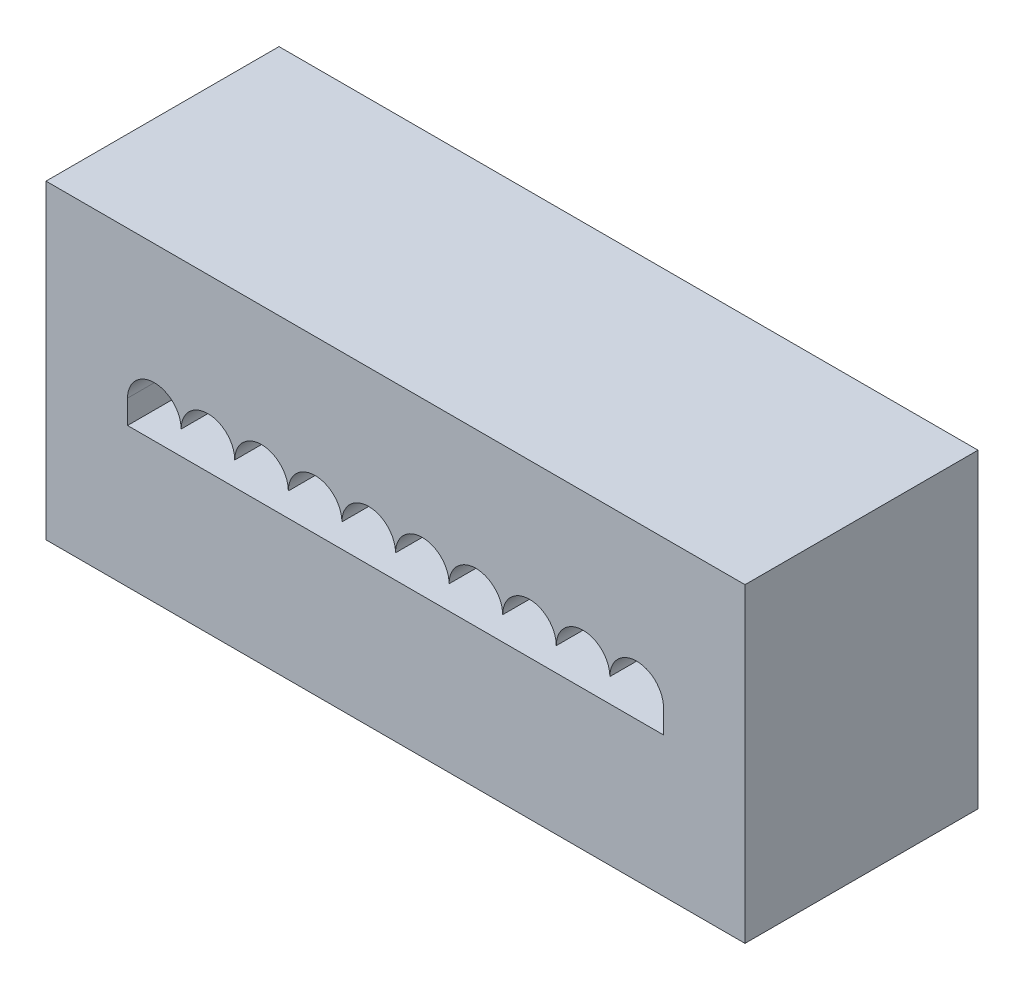
ISO-10303-21;
HEADER;
FILE_DESCRIPTION(('STEP AP214'),'2;1');
FILE_NAME('part.step','',(''),(''),'','','');
FILE_SCHEMA(('AUTOMOTIVE_DESIGN { 1 0 10303 214 1 1 1 1 }'));
ENDSEC;
DATA;
#1=APPLICATION_CONTEXT('core data for automotive mechanical design processes');
#2=APPLICATION_PROTOCOL_DEFINITION('international standard','automotive_design',2000,#1);
#3=PRODUCT_CONTEXT('',#1,'mechanical');
#4=PRODUCT('Part','Part','',(#3));
#5=PRODUCT_RELATED_PRODUCT_CATEGORY('part','',(#4));
#6=PRODUCT_DEFINITION_FORMATION('','',#4);
#7=PRODUCT_DEFINITION_CONTEXT('part definition',#1,'design');
#8=PRODUCT_DEFINITION('design','',#6,#7);
#9=PRODUCT_DEFINITION_SHAPE('','',#8);
#10=(LENGTH_UNIT() NAMED_UNIT(*) SI_UNIT(.MILLI.,.METRE.));
#11=(NAMED_UNIT(*) PLANE_ANGLE_UNIT() SI_UNIT($,.RADIAN.));
#12=(NAMED_UNIT(*) SI_UNIT($,.STERADIAN.) SOLID_ANGLE_UNIT());
#13=UNCERTAINTY_MEASURE_WITH_UNIT(LENGTH_MEASURE(1.E-05),#10,'distance_accuracy_value','');
#14=(GEOMETRIC_REPRESENTATION_CONTEXT(3) GLOBAL_UNCERTAINTY_ASSIGNED_CONTEXT((#13)) GLOBAL_UNIT_ASSIGNED_CONTEXT((#10,
#11,#12)) REPRESENTATION_CONTEXT('',''));
#15=CARTESIAN_POINT('',(0.,0.,0.));
#16=DIRECTION('',(0.,0.,1.));
#17=DIRECTION('',(1.,0.,0.));
#18=AXIS2_PLACEMENT_3D('',#15,#16,#17);
#19=CARTESIAN_POINT('',(-212.6985125591,3.6,43.599338915165));
#20=DIRECTION('',(1.,0.,0.));
#21=DIRECTION('',(0.,0.,-1.));
#22=AXIS2_PLACEMENT_3D('',#19,#20,#21);
#23=PLANE('',#22);
#24=DIRECTION('',(0.,1.,0.));
#25=VECTOR('',#24,1.);
#26=CARTESIAN_POINT('',(-212.6985125591,8.,53.599338915165));
#27=LINE('',#26,#25);
#28=CARTESIAN_POINT('',(-212.6985125591,3.6,53.599338915165));
#29=VERTEX_POINT('',#28);
#30=CARTESIAN_POINT('',(-212.6985125591,4.21,53.599338915165));
#31=VERTEX_POINT('',#30);
#32=EDGE_CURVE('E158',#29,#31,#27,.T.);
#33=ORIENTED_EDGE('',*,*,#32,.T.);
#34=DIRECTION('',(0.,0.,1.));
#35=VECTOR('',#34,1.);
#36=CARTESIAN_POINT('',(-212.6985125591,4.21,43.599338915165));
#37=LINE('',#36,#35);
#38=CARTESIAN_POINT('',(-212.6985125591,4.21,47.599338915165));
#39=VERTEX_POINT('',#38);
#40=EDGE_CURVE('E181',#31,#39,#37,.F.);
#41=ORIENTED_EDGE('',*,*,#40,.T.);
#42=DIRECTION('',(0.,1.,0.));
#43=VECTOR('',#42,1.);
#44=CARTESIAN_POINT('',(-212.6985125591,3.6,47.599338915165));
#45=LINE('',#44,#43);
#46=CARTESIAN_POINT('',(-212.6985125591,3.6,47.599338915165));
#47=VERTEX_POINT('',#46);
#48=EDGE_CURVE('E166',#47,#39,#45,.T.);
#49=ORIENTED_EDGE('',*,*,#48,.F.);
#50=DIRECTION('',(0.,0.,-1.));
#51=VECTOR('',#50,1.);
#52=CARTESIAN_POINT('',(-212.6985125591,3.6,43.599338915165));
#53=LINE('',#52,#51);
#54=EDGE_CURVE('E176',#47,#29,#53,.F.);
#55=ORIENTED_EDGE('',*,*,#54,.T.);
#56=EDGE_LOOP('',(#33,#41,#49,#55));
#57=FACE_BOUND('',#56,.T.);
#58=ADVANCED_FACE('F16',(#57),#23,.F.);
#59=CARTESIAN_POINT('',(-226.4985125591,4.21,43.599338915165));
#60=DIRECTION('',(-1.,0.,0.));
#61=DIRECTION('',(0.,0.,1.));
#62=AXIS2_PLACEMENT_3D('',#59,#60,#61);
#63=PLANE('',#62);
#64=DIRECTION('',(0.,1.,0.));
#65=VECTOR('',#64,1.);
#66=CARTESIAN_POINT('',(-226.4985125591,8.,53.599338915165));
#67=LINE('',#66,#65);
#68=CARTESIAN_POINT('',(-226.4985125591,4.21,53.599338915165));
#69=VERTEX_POINT('',#68);
#70=CARTESIAN_POINT('',(-226.4985125591,3.6,53.599338915165));
#71=VERTEX_POINT('',#70);
#72=EDGE_CURVE('E131',#69,#71,#67,.F.);
#73=ORIENTED_EDGE('',*,*,#72,.T.);
#74=DIRECTION('',(0.,0.,-1.));
#75=VECTOR('',#74,1.);
#76=CARTESIAN_POINT('',(-226.4985125591,3.6,43.599338915165));
#77=LINE('',#76,#75);
#78=CARTESIAN_POINT('',(-226.4985125591,3.6,47.599338915165));
#79=VERTEX_POINT('',#78);
#80=EDGE_CURVE('E175',#71,#79,#77,.T.);
#81=ORIENTED_EDGE('',*,*,#80,.T.);
#82=DIRECTION('',(0.,1.,0.));
#83=VECTOR('',#82,1.);
#84=CARTESIAN_POINT('',(-226.4985125591,4.21,47.599338915165));
#85=LINE('',#84,#83);
#86=CARTESIAN_POINT('',(-226.4985125591,4.21,47.599338915165));
#87=VERTEX_POINT('',#86);
#88=EDGE_CURVE('E163',#87,#79,#85,.F.);
#89=ORIENTED_EDGE('',*,*,#88,.F.);
#90=DIRECTION('',(0.,0.,1.));
#91=VECTOR('',#90,1.);
#92=CARTESIAN_POINT('',(-226.4985125591,4.21,43.599338915165));
#93=LINE('',#92,#91);
#94=EDGE_CURVE('E142',#87,#69,#93,.T.);
#95=ORIENTED_EDGE('',*,*,#94,.T.);
#96=EDGE_LOOP('',(#73,#81,#89,#95));
#97=FACE_BOUND('',#96,.T.);
#98=ADVANCED_FACE('F357',(#97),#63,.F.);
#99=CARTESIAN_POINT('',(-228.5985125591,8.,53.599338915165));
#100=DIRECTION('',(0.,0.,-1.));
#101=DIRECTION('',(-1.,0.,0.));
#102=AXIS2_PLACEMENT_3D('',#99,#100,#101);
#103=PLANE('',#102);
#104=DIRECTION('',(0.,1.,0.));
#105=VECTOR('',#104,1.);
#106=CARTESIAN_POINT('',(-210.5985125591,8.,53.599338915165));
#107=LINE('',#106,#105);
#108=CARTESIAN_POINT('',(-210.5985125591,0.,53.599338915165));
#109=VERTEX_POINT('',#108);
#110=CARTESIAN_POINT('',(-210.5985125591,8.,53.599338915165));
#111=VERTEX_POINT('',#110);
#112=EDGE_CURVE('E186',#109,#111,#107,.T.);
#113=ORIENTED_EDGE('',*,*,#112,.T.);
#114=DIRECTION('',(1.,0.,0.));
#115=VECTOR('',#114,1.);
#116=CARTESIAN_POINT('',(0.,8.,53.599338915165));
#117=LINE('',#116,#115);
#118=CARTESIAN_POINT('',(-228.5985125591,8.,53.599338915165));
#119=VERTEX_POINT('',#118);
#120=EDGE_CURVE('E265',#119,#111,#117,.T.);
#121=ORIENTED_EDGE('',*,*,#120,.F.);
#122=DIRECTION('',(0.,1.,0.));
#123=VECTOR('',#122,1.);
#124=CARTESIAN_POINT('',(-228.5985125591,8.,53.599338915165));
#125=LINE('',#124,#123);
#126=CARTESIAN_POINT('',(-228.5985125591,0.,53.599338915165));
#127=VERTEX_POINT('',#126);
#128=EDGE_CURVE('E272',#119,#127,#125,.F.);
#129=ORIENTED_EDGE('',*,*,#128,.T.);
#130=DIRECTION('',(1.,0.,0.));
#131=VECTOR('',#130,1.);
#132=CARTESIAN_POINT('',(0.,0.,53.599338915165));
#133=LINE('',#132,#131);
#134=EDGE_CURVE('E275',#127,#109,#133,.T.);
#135=ORIENTED_EDGE('',*,*,#134,.T.);
#136=EDGE_LOOP('',(#113,#121,#129,#135));
#137=FACE_BOUND('',#136,.T.);
#138=ORIENTED_EDGE('',*,*,#32,.F.);
#139=DIRECTION('',(1.,0.,0.));
#140=VECTOR('',#139,1.);
#141=CARTESIAN_POINT('',(-226.4985125591,3.6,53.599338915165));
#142=LINE('',#141,#140);
#143=EDGE_CURVE('E173',#29,#71,#142,.F.);
#144=ORIENTED_EDGE('',*,*,#143,.T.);
#145=ORIENTED_EDGE('',*,*,#72,.F.);
#146=CARTESIAN_POINT('',(-225.8085125591,4.21,53.599338915165));
#147=DIRECTION('',(0.,0.,1.));
#148=DIRECTION('',(1.,0.,0.));
#149=AXIS2_PLACEMENT_3D('',#146,#147,#148);
#150=CIRCLE('',#149,0.69);
#151=CARTESIAN_POINT('',(-225.1185125591,4.21,53.599338915165));
#152=VERTEX_POINT('',#151);
#153=EDGE_CURVE('E19',#69,#152,#150,.F.);
#154=ORIENTED_EDGE('',*,*,#153,.T.);
#155=CARTESIAN_POINT('',(-224.4285125591,4.21,53.599338915165));
#156=DIRECTION('',(0.,0.,1.));
#157=DIRECTION('',(1.,0.,0.));
#158=AXIS2_PLACEMENT_3D('',#155,#156,#157);
#159=CIRCLE('',#158,0.69);
#160=CARTESIAN_POINT('',(-223.7385125591,4.21,53.599338915165));
#161=VERTEX_POINT('',#160);
#162=EDGE_CURVE('E135',#152,#161,#159,.F.);
#163=ORIENTED_EDGE('',*,*,#162,.T.);
#164=CARTESIAN_POINT('',(-223.0485125591,4.21,53.599338915165));
#165=DIRECTION('',(0.,0.,1.));
#166=DIRECTION('',(1.,0.,0.));
#167=AXIS2_PLACEMENT_3D('',#164,#165,#166);
#168=CIRCLE('',#167,0.69);
#169=CARTESIAN_POINT('',(-222.3585125591,4.21,53.599338915165));
#170=VERTEX_POINT('',#169);
#171=EDGE_CURVE('E244',#161,#170,#168,.F.);
#172=ORIENTED_EDGE('',*,*,#171,.T.);
#173=CARTESIAN_POINT('',(-221.6685125591,4.21,53.599338915165));
#174=DIRECTION('',(0.,0.,1.));
#175=DIRECTION('',(1.,0.,0.));
#176=AXIS2_PLACEMENT_3D('',#173,#174,#175);
#177=CIRCLE('',#176,0.69);
#178=CARTESIAN_POINT('',(-220.9785125591,4.21,53.599338915165));
#179=VERTEX_POINT('',#178);
#180=EDGE_CURVE('E241',#170,#179,#177,.F.);
#181=ORIENTED_EDGE('',*,*,#180,.T.);
#182=CARTESIAN_POINT('',(-220.2885125591,4.21,53.599338915165));
#183=DIRECTION('',(0.,0.,1.));
#184=DIRECTION('',(1.,0.,0.));
#185=AXIS2_PLACEMENT_3D('',#182,#183,#184);
#186=CIRCLE('',#185,0.69);
#187=CARTESIAN_POINT('',(-219.5985125591,4.21,53.599338915165));
#188=VERTEX_POINT('',#187);
#189=EDGE_CURVE('E238',#179,#188,#186,.F.);
#190=ORIENTED_EDGE('',*,*,#189,.T.);
#191=CARTESIAN_POINT('',(-218.9085125591,4.21,53.599338915165));
#192=DIRECTION('',(0.,0.,1.));
#193=DIRECTION('',(1.,0.,0.));
#194=AXIS2_PLACEMENT_3D('',#191,#192,#193);
#195=CIRCLE('',#194,0.69);
#196=CARTESIAN_POINT('',(-218.2185125591,4.21,53.599338915165));
#197=VERTEX_POINT('',#196);
#198=EDGE_CURVE('E235',#188,#197,#195,.F.);
#199=ORIENTED_EDGE('',*,*,#198,.T.);
#200=CARTESIAN_POINT('',(-217.5285125591,4.21,53.599338915165));
#201=DIRECTION('',(0.,0.,1.));
#202=DIRECTION('',(1.,0.,0.));
#203=AXIS2_PLACEMENT_3D('',#200,#201,#202);
#204=CIRCLE('',#203,0.69);
#205=CARTESIAN_POINT('',(-216.8385125591,4.21,53.599338915165));
#206=VERTEX_POINT('',#205);
#207=EDGE_CURVE('E232',#197,#206,#204,.F.);
#208=ORIENTED_EDGE('',*,*,#207,.T.);
#209=CARTESIAN_POINT('',(-216.1485125591,4.21,53.599338915165));
#210=DIRECTION('',(0.,0.,1.));
#211=DIRECTION('',(1.,0.,0.));
#212=AXIS2_PLACEMENT_3D('',#209,#210,#211);
#213=CIRCLE('',#212,0.69);
#214=CARTESIAN_POINT('',(-215.4585125591,4.21,53.599338915165));
#215=VERTEX_POINT('',#214);
#216=EDGE_CURVE('E229',#206,#215,#213,.F.);
#217=ORIENTED_EDGE('',*,*,#216,.T.);
#218=CARTESIAN_POINT('',(-214.7685125591,4.21,53.599338915165));
#219=DIRECTION('',(0.,0.,1.));
#220=DIRECTION('',(1.,0.,0.));
#221=AXIS2_PLACEMENT_3D('',#218,#219,#220);
#222=CIRCLE('',#221,0.69);
#223=CARTESIAN_POINT('',(-214.0785125591,4.21,53.599338915165));
#224=VERTEX_POINT('',#223);
#225=EDGE_CURVE('E226',#215,#224,#222,.F.);
#226=ORIENTED_EDGE('',*,*,#225,.T.);
#227=CARTESIAN_POINT('',(-213.3885125591,4.21,53.599338915165));
#228=DIRECTION('',(0.,0.,1.));
#229=DIRECTION('',(1.,0.,0.));
#230=AXIS2_PLACEMENT_3D('',#227,#228,#229);
#231=CIRCLE('',#230,0.69);
#232=EDGE_CURVE('E222',#224,#31,#231,.F.);
#233=ORIENTED_EDGE('',*,*,#232,.T.);
#234=EDGE_LOOP('',(#138,#144,#145,#154,#163,#172,#181,#190,#199,#208,#217,#226,#233));
#235=FACE_BOUND('',#234,.T.);
#236=ADVANCED_FACE('F134',(#137,#235),#103,.F.);
#237=CARTESIAN_POINT('',(-225.8085125591,4.21,43.599338915165));
#238=DIRECTION('',(0.,0.,1.));
#239=DIRECTION('',(1.,0.,0.));
#240=AXIS2_PLACEMENT_3D('',#237,#238,#239);
#241=CYLINDRICAL_SURFACE('',#240,0.69);
#242=ORIENTED_EDGE('',*,*,#153,.F.);
#243=ORIENTED_EDGE('',*,*,#94,.F.);
#244=CARTESIAN_POINT('',(-225.8085125591,4.21,47.599338915165));
#245=DIRECTION('',(0.,0.,1.));
#246=DIRECTION('',(1.,0.,0.));
#247=AXIS2_PLACEMENT_3D('',#244,#245,#246);
#248=CIRCLE('',#247,0.69);
#249=CARTESIAN_POINT('',(-225.1185125591,4.21,47.599338915165));
#250=VERTEX_POINT('',#249);
#251=EDGE_CURVE('E152',#87,#250,#248,.F.);
#252=ORIENTED_EDGE('',*,*,#251,.T.);
#253=DIRECTION('',(0.,0.,1.));
#254=VECTOR('',#253,1.);
#255=CARTESIAN_POINT('',(-225.1185125591,4.21,43.599338915165));
#256=LINE('',#255,#254);
#257=EDGE_CURVE('E141',#250,#152,#256,.T.);
#258=ORIENTED_EDGE('',*,*,#257,.T.);
#259=EDGE_LOOP('',(#242,#243,#252,#258));
#260=FACE_BOUND('',#259,.T.);
#261=ADVANCED_FACE('F150',(#260),#241,.F.);
#262=CARTESIAN_POINT('',(-224.4285125591,4.21,43.599338915165));
#263=DIRECTION('',(0.,0.,1.));
#264=DIRECTION('',(1.,0.,0.));
#265=AXIS2_PLACEMENT_3D('',#262,#263,#264);
#266=CYLINDRICAL_SURFACE('',#265,0.69);
#267=ORIENTED_EDGE('',*,*,#162,.F.);
#268=ORIENTED_EDGE('',*,*,#257,.F.);
#269=CARTESIAN_POINT('',(-224.4285125591,4.21,47.599338915165));
#270=DIRECTION('',(0.,0.,1.));
#271=DIRECTION('',(1.,0.,0.));
#272=AXIS2_PLACEMENT_3D('',#269,#270,#271);
#273=CIRCLE('',#272,0.69);
#274=CARTESIAN_POINT('',(-223.7385125591,4.21,47.599338915165));
#275=VERTEX_POINT('',#274);
#276=EDGE_CURVE('E219',#250,#275,#273,.F.);
#277=ORIENTED_EDGE('',*,*,#276,.T.);
#278=DIRECTION('',(0.,0.,1.));
#279=VECTOR('',#278,1.);
#280=CARTESIAN_POINT('',(-223.7385125591,4.21,43.599338915165));
#281=LINE('',#280,#279);
#282=EDGE_CURVE('E148',#275,#161,#281,.T.);
#283=ORIENTED_EDGE('',*,*,#282,.T.);
#284=EDGE_LOOP('',(#267,#268,#277,#283));
#285=FACE_BOUND('',#284,.T.);
#286=ADVANCED_FACE('F145',(#285),#266,.F.);
#287=CARTESIAN_POINT('',(-223.0485125591,4.21,43.599338915165));
#288=DIRECTION('',(0.,0.,1.));
#289=DIRECTION('',(1.,0.,0.));
#290=AXIS2_PLACEMENT_3D('',#287,#288,#289);
#291=CYLINDRICAL_SURFACE('',#290,0.69);
#292=ORIENTED_EDGE('',*,*,#171,.F.);
#293=ORIENTED_EDGE('',*,*,#282,.F.);
#294=CARTESIAN_POINT('',(-223.0485125591,4.21,47.599338915165));
#295=DIRECTION('',(0.,0.,1.));
#296=DIRECTION('',(1.,0.,0.));
#297=AXIS2_PLACEMENT_3D('',#294,#295,#296);
#298=CIRCLE('',#297,0.69);
#299=CARTESIAN_POINT('',(-222.3585125591,4.21,47.599338915165));
#300=VERTEX_POINT('',#299);
#301=EDGE_CURVE('E216',#275,#300,#298,.F.);
#302=ORIENTED_EDGE('',*,*,#301,.T.);
#303=DIRECTION('',(0.,0.,1.));
#304=VECTOR('',#303,1.);
#305=CARTESIAN_POINT('',(-222.3585125591,4.21,43.599338915165));
#306=LINE('',#305,#304);
#307=EDGE_CURVE('E243',#300,#170,#306,.T.);
#308=ORIENTED_EDGE('',*,*,#307,.T.);
#309=EDGE_LOOP('',(#292,#293,#302,#308));
#310=FACE_BOUND('',#309,.T.);
#311=ADVANCED_FACE('F348',(#310),#291,.F.);
#312=CARTESIAN_POINT('',(-221.6685125591,4.21,43.599338915165));
#313=DIRECTION('',(0.,0.,1.));
#314=DIRECTION('',(1.,0.,0.));
#315=AXIS2_PLACEMENT_3D('',#312,#313,#314);
#316=CYLINDRICAL_SURFACE('',#315,0.69);
#317=ORIENTED_EDGE('',*,*,#180,.F.);
#318=ORIENTED_EDGE('',*,*,#307,.F.);
#319=CARTESIAN_POINT('',(-221.6685125591,4.21,47.599338915165));
#320=DIRECTION('',(0.,0.,1.));
#321=DIRECTION('',(1.,0.,0.));
#322=AXIS2_PLACEMENT_3D('',#319,#320,#321);
#323=CIRCLE('',#322,0.69);
#324=CARTESIAN_POINT('',(-220.9785125591,4.21,47.599338915165));
#325=VERTEX_POINT('',#324);
#326=EDGE_CURVE('E213',#300,#325,#323,.F.);
#327=ORIENTED_EDGE('',*,*,#326,.T.);
#328=DIRECTION('',(0.,0.,1.));
#329=VECTOR('',#328,1.);
#330=CARTESIAN_POINT('',(-220.9785125591,4.21,43.599338915165));
#331=LINE('',#330,#329);
#332=EDGE_CURVE('E240',#325,#179,#331,.T.);
#333=ORIENTED_EDGE('',*,*,#332,.T.);
#334=EDGE_LOOP('',(#317,#318,#327,#333));
#335=FACE_BOUND('',#334,.T.);
#336=ADVANCED_FACE('F344',(#335),#316,.F.);
#337=CARTESIAN_POINT('',(-220.2885125591,4.21,43.599338915165));
#338=DIRECTION('',(0.,0.,1.));
#339=DIRECTION('',(1.,0.,0.));
#340=AXIS2_PLACEMENT_3D('',#337,#338,#339);
#341=CYLINDRICAL_SURFACE('',#340,0.69);
#342=ORIENTED_EDGE('',*,*,#189,.F.);
#343=ORIENTED_EDGE('',*,*,#332,.F.);
#344=CARTESIAN_POINT('',(-220.2885125591,4.21,47.599338915165));
#345=DIRECTION('',(0.,0.,1.));
#346=DIRECTION('',(1.,0.,0.));
#347=AXIS2_PLACEMENT_3D('',#344,#345,#346);
#348=CIRCLE('',#347,0.69);
#349=CARTESIAN_POINT('',(-219.5985125591,4.21,47.599338915165));
#350=VERTEX_POINT('',#349);
#351=EDGE_CURVE('E210',#325,#350,#348,.F.);
#352=ORIENTED_EDGE('',*,*,#351,.T.);
#353=DIRECTION('',(0.,0.,1.));
#354=VECTOR('',#353,1.);
#355=CARTESIAN_POINT('',(-219.5985125591,4.21,43.599338915165));
#356=LINE('',#355,#354);
#357=EDGE_CURVE('E237',#350,#188,#356,.T.);
#358=ORIENTED_EDGE('',*,*,#357,.T.);
#359=EDGE_LOOP('',(#342,#343,#352,#358));
#360=FACE_BOUND('',#359,.T.);
#361=ADVANCED_FACE('F340',(#360),#341,.F.);
#362=CARTESIAN_POINT('',(-218.9085125591,4.21,43.599338915165));
#363=DIRECTION('',(0.,0.,1.));
#364=DIRECTION('',(1.,0.,0.));
#365=AXIS2_PLACEMENT_3D('',#362,#363,#364);
#366=CYLINDRICAL_SURFACE('',#365,0.69);
#367=ORIENTED_EDGE('',*,*,#198,.F.);
#368=ORIENTED_EDGE('',*,*,#357,.F.);
#369=CARTESIAN_POINT('',(-218.9085125591,4.21,47.599338915165));
#370=DIRECTION('',(0.,0.,1.));
#371=DIRECTION('',(1.,0.,0.));
#372=AXIS2_PLACEMENT_3D('',#369,#370,#371);
#373=CIRCLE('',#372,0.69);
#374=CARTESIAN_POINT('',(-218.2185125591,4.21,47.599338915165));
#375=VERTEX_POINT('',#374);
#376=EDGE_CURVE('E207',#350,#375,#373,.F.);
#377=ORIENTED_EDGE('',*,*,#376,.T.);
#378=DIRECTION('',(0.,0.,1.));
#379=VECTOR('',#378,1.);
#380=CARTESIAN_POINT('',(-218.2185125591,4.21,43.599338915165));
#381=LINE('',#380,#379);
#382=EDGE_CURVE('E234',#375,#197,#381,.T.);
#383=ORIENTED_EDGE('',*,*,#382,.T.);
#384=EDGE_LOOP('',(#367,#368,#377,#383));
#385=FACE_BOUND('',#384,.T.);
#386=ADVANCED_FACE('F336',(#385),#366,.F.);
#387=CARTESIAN_POINT('',(-217.5285125591,4.21,43.599338915165));
#388=DIRECTION('',(0.,0.,1.));
#389=DIRECTION('',(1.,0.,0.));
#390=AXIS2_PLACEMENT_3D('',#387,#388,#389);
#391=CYLINDRICAL_SURFACE('',#390,0.69);
#392=ORIENTED_EDGE('',*,*,#207,.F.);
#393=ORIENTED_EDGE('',*,*,#382,.F.);
#394=CARTESIAN_POINT('',(-217.5285125591,4.21,47.599338915165));
#395=DIRECTION('',(0.,0.,1.));
#396=DIRECTION('',(1.,0.,0.));
#397=AXIS2_PLACEMENT_3D('',#394,#395,#396);
#398=CIRCLE('',#397,0.69);
#399=CARTESIAN_POINT('',(-216.8385125591,4.21,47.599338915165));
#400=VERTEX_POINT('',#399);
#401=EDGE_CURVE('E204',#375,#400,#398,.F.);
#402=ORIENTED_EDGE('',*,*,#401,.T.);
#403=DIRECTION('',(0.,0.,1.));
#404=VECTOR('',#403,1.);
#405=CARTESIAN_POINT('',(-216.8385125591,4.21,43.599338915165));
#406=LINE('',#405,#404);
#407=EDGE_CURVE('E231',#400,#206,#406,.T.);
#408=ORIENTED_EDGE('',*,*,#407,.T.);
#409=EDGE_LOOP('',(#392,#393,#402,#408));
#410=FACE_BOUND('',#409,.T.);
#411=ADVANCED_FACE('F332',(#410),#391,.F.);
#412=CARTESIAN_POINT('',(-216.1485125591,4.21,43.599338915165));
#413=DIRECTION('',(0.,0.,1.));
#414=DIRECTION('',(1.,0.,0.));
#415=AXIS2_PLACEMENT_3D('',#412,#413,#414);
#416=CYLINDRICAL_SURFACE('',#415,0.69);
#417=ORIENTED_EDGE('',*,*,#216,.F.);
#418=ORIENTED_EDGE('',*,*,#407,.F.);
#419=CARTESIAN_POINT('',(-216.1485125591,4.21,47.599338915165));
#420=DIRECTION('',(0.,0.,1.));
#421=DIRECTION('',(1.,0.,0.));
#422=AXIS2_PLACEMENT_3D('',#419,#420,#421);
#423=CIRCLE('',#422,0.69);
#424=CARTESIAN_POINT('',(-215.4585125591,4.21,47.599338915165));
#425=VERTEX_POINT('',#424);
#426=EDGE_CURVE('E201',#400,#425,#423,.F.);
#427=ORIENTED_EDGE('',*,*,#426,.T.);
#428=DIRECTION('',(0.,0.,1.));
#429=VECTOR('',#428,1.);
#430=CARTESIAN_POINT('',(-215.4585125591,4.21,43.599338915165));
#431=LINE('',#430,#429);
#432=EDGE_CURVE('E228',#425,#215,#431,.T.);
#433=ORIENTED_EDGE('',*,*,#432,.T.);
#434=EDGE_LOOP('',(#417,#418,#427,#433));
#435=FACE_BOUND('',#434,.T.);
#436=ADVANCED_FACE('F328',(#435),#416,.F.);
#437=CARTESIAN_POINT('',(-214.7685125591,4.21,43.599338915165));
#438=DIRECTION('',(0.,0.,1.));
#439=DIRECTION('',(1.,0.,0.));
#440=AXIS2_PLACEMENT_3D('',#437,#438,#439);
#441=CYLINDRICAL_SURFACE('',#440,0.69);
#442=ORIENTED_EDGE('',*,*,#225,.F.);
#443=ORIENTED_EDGE('',*,*,#432,.F.);
#444=CARTESIAN_POINT('',(-214.7685125591,4.21,47.599338915165));
#445=DIRECTION('',(0.,0.,1.));
#446=DIRECTION('',(1.,0.,0.));
#447=AXIS2_PLACEMENT_3D('',#444,#445,#446);
#448=CIRCLE('',#447,0.69);
#449=CARTESIAN_POINT('',(-214.0785125591,4.21,47.599338915165));
#450=VERTEX_POINT('',#449);
#451=EDGE_CURVE('E198',#425,#450,#448,.F.);
#452=ORIENTED_EDGE('',*,*,#451,.T.);
#453=DIRECTION('',(0.,0.,1.));
#454=VECTOR('',#453,1.);
#455=CARTESIAN_POINT('',(-214.0785125591,4.21,43.599338915165));
#456=LINE('',#455,#454);
#457=EDGE_CURVE('E225',#450,#224,#456,.T.);
#458=ORIENTED_EDGE('',*,*,#457,.T.);
#459=EDGE_LOOP('',(#442,#443,#452,#458));
#460=FACE_BOUND('',#459,.T.);
#461=ADVANCED_FACE('F324',(#460),#441,.F.);
#462=CARTESIAN_POINT('',(-213.3885125591,4.21,43.599338915165));
#463=DIRECTION('',(0.,0.,1.));
#464=DIRECTION('',(1.,0.,0.));
#465=AXIS2_PLACEMENT_3D('',#462,#463,#464);
#466=CYLINDRICAL_SURFACE('',#465,0.69);
#467=ORIENTED_EDGE('',*,*,#232,.F.);
#468=ORIENTED_EDGE('',*,*,#457,.F.);
#469=CARTESIAN_POINT('',(-213.3885125591,4.21,47.599338915165));
#470=DIRECTION('',(0.,0.,1.));
#471=DIRECTION('',(1.,0.,0.));
#472=AXIS2_PLACEMENT_3D('',#469,#470,#471);
#473=CIRCLE('',#472,0.69);
#474=EDGE_CURVE('E193',#450,#39,#473,.F.);
#475=ORIENTED_EDGE('',*,*,#474,.T.);
#476=ORIENTED_EDGE('',*,*,#40,.F.);
#477=EDGE_LOOP('',(#467,#468,#475,#476));
#478=FACE_BOUND('',#477,.T.);
#479=ADVANCED_FACE('F320',(#478),#466,.F.);
#480=CARTESIAN_POINT('',(-226.4985125591,3.6,43.599338915165));
#481=DIRECTION('',(0.,-1.,0.));
#482=DIRECTION('',(0.,0.,-1.));
#483=AXIS2_PLACEMENT_3D('',#480,#481,#482);
#484=PLANE('',#483);
#485=ORIENTED_EDGE('',*,*,#143,.F.);
#486=ORIENTED_EDGE('',*,*,#54,.F.);
#487=DIRECTION('',(1.,0.,0.));
#488=VECTOR('',#487,1.);
#489=CARTESIAN_POINT('',(-228.5985125591,3.6,47.599338915165));
#490=LINE('',#489,#488);
#491=EDGE_CURVE('E189',#47,#79,#490,.F.);
#492=ORIENTED_EDGE('',*,*,#491,.T.);
#493=ORIENTED_EDGE('',*,*,#80,.F.);
#494=EDGE_LOOP('',(#485,#486,#492,#493));
#495=FACE_BOUND('',#494,.T.);
#496=ADVANCED_FACE('F317',(#495),#484,.F.);
#497=CARTESIAN_POINT('',(-210.5985125591,8.,47.599338915165));
#498=DIRECTION('',(-1.,0.,0.));
#499=DIRECTION('',(0.,0.,1.));
#500=AXIS2_PLACEMENT_3D('',#497,#498,#499);
#501=PLANE('',#500);
#502=DIRECTION('',(0.,1.,0.));
#503=VECTOR('',#502,1.);
#504=CARTESIAN_POINT('',(-210.5985125591,8.,47.599338915165));
#505=LINE('',#504,#503);
#506=CARTESIAN_POINT('',(-210.5985125591,0.,47.599338915165));
#507=VERTEX_POINT('',#506);
#508=CARTESIAN_POINT('',(-210.5985125591,8.,47.599338915165));
#509=VERTEX_POINT('',#508);
#510=EDGE_CURVE('E192',#507,#509,#505,.T.);
#511=ORIENTED_EDGE('',*,*,#510,.T.);
#512=DIRECTION('',(0.,0.,1.));
#513=VECTOR('',#512,1.);
#514=CARTESIAN_POINT('',(-210.5985125591,8.,0.));
#515=LINE('',#514,#513);
#516=EDGE_CURVE('E267',#111,#509,#515,.F.);
#517=ORIENTED_EDGE('',*,*,#516,.F.);
#518=ORIENTED_EDGE('',*,*,#112,.F.);
#519=DIRECTION('',(0.,0.,1.));
#520=VECTOR('',#519,1.);
#521=CARTESIAN_POINT('',(-210.5985125591,0.,0.));
#522=LINE('',#521,#520);
#523=EDGE_CURVE('E278',#109,#507,#522,.F.);
#524=ORIENTED_EDGE('',*,*,#523,.T.);
#525=EDGE_LOOP('',(#511,#517,#518,#524));
#526=FACE_BOUND('',#525,.T.);
#527=ADVANCED_FACE('F300',(#526),#501,.F.);
#528=CARTESIAN_POINT('',(0.,8.,0.));
#529=DIRECTION('',(0.,1.,0.));
#530=DIRECTION('',(0.,0.,1.));
#531=AXIS2_PLACEMENT_3D('',#528,#529,#530);
#532=PLANE('',#531);
#533=ORIENTED_EDGE('',*,*,#516,.T.);
#534=DIRECTION('',(1.,0.,0.));
#535=VECTOR('',#534,1.);
#536=CARTESIAN_POINT('',(-228.5985125591,8.,47.599338915165));
#537=LINE('',#536,#535);
#538=CARTESIAN_POINT('',(-228.5985125591,8.,47.599338915165));
#539=VERTEX_POINT('',#538);
#540=EDGE_CURVE('E284',#509,#539,#537,.F.);
#541=ORIENTED_EDGE('',*,*,#540,.T.);
#542=DIRECTION('',(0.,0.,-1.));
#543=VECTOR('',#542,1.);
#544=CARTESIAN_POINT('',(-228.5985125591,8.,47.599338915165));
#545=LINE('',#544,#543);
#546=EDGE_CURVE('E269',#539,#119,#545,.F.);
#547=ORIENTED_EDGE('',*,*,#546,.T.);
#548=ORIENTED_EDGE('',*,*,#120,.T.);
#549=EDGE_LOOP('',(#533,#541,#547,#548));
#550=FACE_BOUND('',#549,.T.);
#551=ADVANCED_FACE('F297',(#550),#532,.T.);
#552=CARTESIAN_POINT('',(-228.5985125591,8.,47.599338915165));
#553=DIRECTION('',(1.,0.,0.));
#554=DIRECTION('',(0.,0.,-1.));
#555=AXIS2_PLACEMENT_3D('',#552,#553,#554);
#556=PLANE('',#555);
#557=ORIENTED_EDGE('',*,*,#128,.F.);
#558=ORIENTED_EDGE('',*,*,#546,.F.);
#559=DIRECTION('',(0.,1.,0.));
#560=VECTOR('',#559,1.);
#561=CARTESIAN_POINT('',(-228.5985125591,8.,47.599338915165));
#562=LINE('',#561,#560);
#563=CARTESIAN_POINT('',(-228.5985125591,0.,47.599338915165));
#564=VERTEX_POINT('',#563);
#565=EDGE_CURVE('E25',#539,#564,#562,.F.);
#566=ORIENTED_EDGE('',*,*,#565,.T.);
#567=DIRECTION('',(0.,0.,1.));
#568=VECTOR('',#567,1.);
#569=CARTESIAN_POINT('',(-228.5985125591,0.,0.));
#570=LINE('',#569,#568);
#571=EDGE_CURVE('E33',#564,#127,#570,.T.);
#572=ORIENTED_EDGE('',*,*,#571,.T.);
#573=EDGE_LOOP('',(#557,#558,#566,#572));
#574=FACE_BOUND('',#573,.T.);
#575=ADVANCED_FACE('F291',(#574),#556,.F.);
#576=CARTESIAN_POINT('',(0.,0.,0.));
#577=DIRECTION('',(0.,1.,0.));
#578=DIRECTION('',(0.,0.,1.));
#579=AXIS2_PLACEMENT_3D('',#576,#577,#578);
#580=PLANE('',#579);
#581=DIRECTION('',(1.,0.,0.));
#582=VECTOR('',#581,1.);
#583=CARTESIAN_POINT('',(-228.5985125591,0.,47.599338915165));
#584=LINE('',#583,#582);
#585=EDGE_CURVE('E10',#564,#507,#584,.T.);
#586=ORIENTED_EDGE('',*,*,#585,.T.);
#587=ORIENTED_EDGE('',*,*,#523,.F.);
#588=ORIENTED_EDGE('',*,*,#134,.F.);
#589=ORIENTED_EDGE('',*,*,#571,.F.);
#590=EDGE_LOOP('',(#586,#587,#588,#589));
#591=FACE_BOUND('',#590,.T.);
#592=ADVANCED_FACE('F302',(#591),#580,.F.);
#593=CARTESIAN_POINT('',(-228.5985125591,8.,47.599338915165));
#594=DIRECTION('',(0.,0.,1.));
#595=DIRECTION('',(1.,0.,0.));
#596=AXIS2_PLACEMENT_3D('',#593,#594,#595);
#597=PLANE('',#596);
#598=ORIENTED_EDGE('',*,*,#565,.F.);
#599=ORIENTED_EDGE('',*,*,#540,.F.);
#600=ORIENTED_EDGE('',*,*,#510,.F.);
#601=ORIENTED_EDGE('',*,*,#585,.F.);
#602=EDGE_LOOP('',(#598,#599,#600,#601));
#603=FACE_BOUND('',#602,.T.);
#604=ORIENTED_EDGE('',*,*,#48,.T.);
#605=ORIENTED_EDGE('',*,*,#474,.F.);
#606=ORIENTED_EDGE('',*,*,#451,.F.);
#607=ORIENTED_EDGE('',*,*,#426,.F.);
#608=ORIENTED_EDGE('',*,*,#401,.F.);
#609=ORIENTED_EDGE('',*,*,#376,.F.);
#610=ORIENTED_EDGE('',*,*,#351,.F.);
#611=ORIENTED_EDGE('',*,*,#326,.F.);
#612=ORIENTED_EDGE('',*,*,#301,.F.);
#613=ORIENTED_EDGE('',*,*,#276,.F.);
#614=ORIENTED_EDGE('',*,*,#251,.F.);
#615=ORIENTED_EDGE('',*,*,#88,.T.);
#616=ORIENTED_EDGE('',*,*,#491,.F.);
#617=EDGE_LOOP('',(#604,#605,#606,#607,#608,#609,#610,#611,#612,#613,#614,#615,#616));
#618=FACE_BOUND('',#617,.T.);
#619=ADVANCED_FACE('F294',(#603,#618),#597,.F.);
#620=CLOSED_SHELL('',(#58,#98,#236,#261,#286,#311,#336,#361,#386,#411,#436,#461,#479,#496,#527,
#551,#575,#592,#619));
#621=MANIFOLD_SOLID_BREP('B1',#620);
#622=ADVANCED_BREP_SHAPE_REPRESENTATION('',(#18,#621),#14);
#623=SHAPE_DEFINITION_REPRESENTATION(#9,#622);
ENDSEC;
END-ISO-10303-21;
